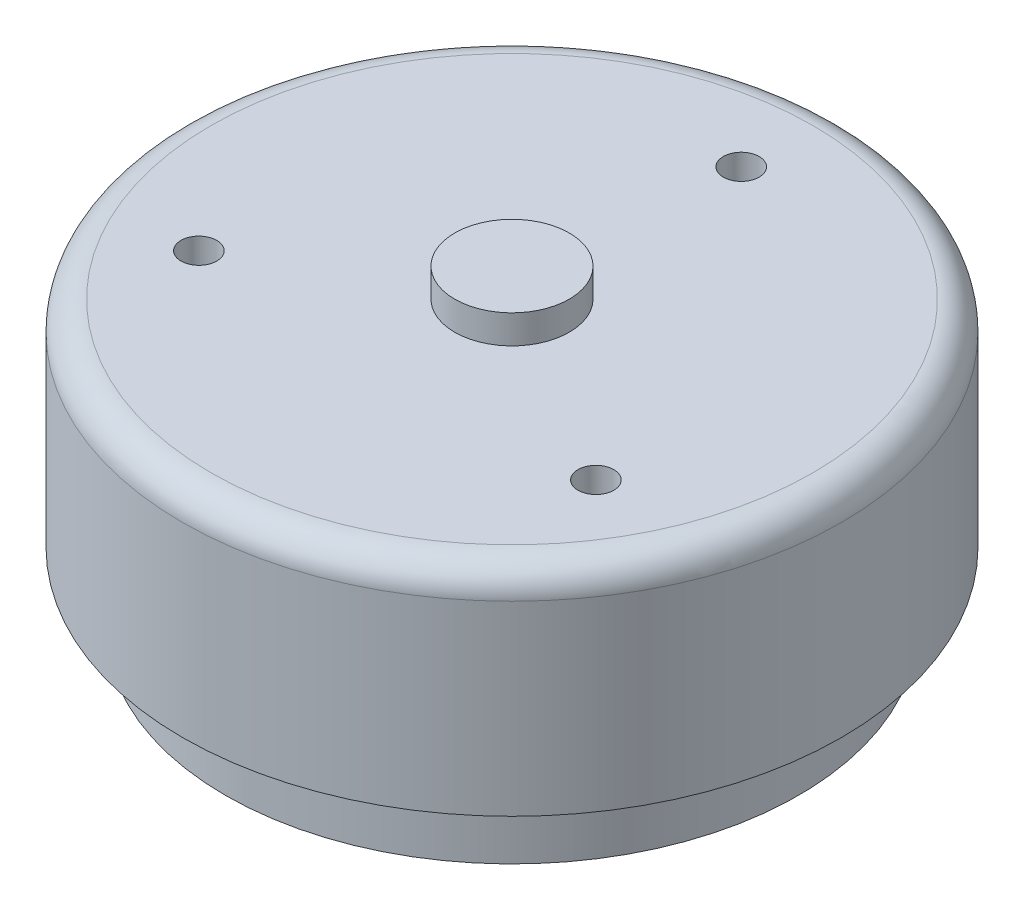
ISO-10303-21;
HEADER;
FILE_DESCRIPTION(('STEP AP214'),'2;1');
FILE_NAME('part.step','',(''),(''),'','','');
FILE_SCHEMA(('AUTOMOTIVE_DESIGN { 1 0 10303 214 1 1 1 1 }'));
ENDSEC;
DATA;
#1=APPLICATION_CONTEXT('core data for automotive mechanical design processes');
#2=APPLICATION_PROTOCOL_DEFINITION('international standard','automotive_design',2000,#1);
#3=PRODUCT_CONTEXT('',#1,'mechanical');
#4=PRODUCT('Part','Part','',(#3));
#5=PRODUCT_RELATED_PRODUCT_CATEGORY('part','',(#4));
#6=PRODUCT_DEFINITION_FORMATION('','',#4);
#7=PRODUCT_DEFINITION_CONTEXT('part definition',#1,'design');
#8=PRODUCT_DEFINITION('design','',#6,#7);
#9=PRODUCT_DEFINITION_SHAPE('','',#8);
#10=(LENGTH_UNIT() NAMED_UNIT(*) SI_UNIT(.MILLI.,.METRE.));
#11=(NAMED_UNIT(*) PLANE_ANGLE_UNIT() SI_UNIT($,.RADIAN.));
#12=(NAMED_UNIT(*) SI_UNIT($,.STERADIAN.) SOLID_ANGLE_UNIT());
#13=UNCERTAINTY_MEASURE_WITH_UNIT(LENGTH_MEASURE(1.E-05),#10,'distance_accuracy_value','');
#14=(GEOMETRIC_REPRESENTATION_CONTEXT(3) GLOBAL_UNCERTAINTY_ASSIGNED_CONTEXT((#13)) GLOBAL_UNIT_ASSIGNED_CONTEXT((#10,
#11,#12)) REPRESENTATION_CONTEXT('',''));
#15=CARTESIAN_POINT('',(0.,0.,0.));
#16=DIRECTION('',(0.,0.,1.));
#17=DIRECTION('',(1.,0.,0.));
#18=AXIS2_PLACEMENT_3D('',#15,#16,#17);
#19=CARTESIAN_POINT('',(-50.,10.,26.5605836335135));
#20=DIRECTION('',(0.,1.,0.));
#21=DIRECTION('',(0.,0.,1.));
#22=AXIS2_PLACEMENT_3D('',#19,#20,#21);
#23=PLANE('',#22);
#24=CARTESIAN_POINT('',(0.,10.,0.));
#25=DIRECTION('',(0.,1.,0.));
#26=DIRECTION('',(0.,0.,1.));
#27=AXIS2_PLACEMENT_3D('',#24,#25,#26);
#28=CIRCLE('',#27,23.);
#29=CARTESIAN_POINT('',(0.,10.,23.));
#30=VERTEX_POINT('',#29);
#31=EDGE_CURVE('E51',#30,#30,#28,.T.);
#32=ORIENTED_EDGE('',*,*,#31,.F.);
#33=EDGE_LOOP('',(#32));
#34=FACE_BOUND('',#33,.T.);
#35=CARTESIAN_POINT('',(0.,10.,0.));
#36=DIRECTION('',(0.,1.,0.));
#37=DIRECTION('',(0.,0.,1.));
#38=AXIS2_PLACEMENT_3D('',#35,#36,#37);
#39=CIRCLE('',#38,20.);
#40=CARTESIAN_POINT('',(0.,10.,20.));
#41=VERTEX_POINT('',#40);
#42=EDGE_CURVE('E10',#41,#41,#39,.F.);
#43=ORIENTED_EDGE('',*,*,#42,.F.);
#44=EDGE_LOOP('',(#43));
#45=FACE_BOUND('',#44,.T.);
#46=ADVANCED_FACE('F32',(#34,#45),#23,.F.);
#47=CARTESIAN_POINT('',(0.,25.,0.));
#48=DIRECTION('',(0.,1.,0.));
#49=DIRECTION('',(0.,0.,1.));
#50=AXIS2_PLACEMENT_3D('',#47,#48,#49);
#51=PLANE('',#50);
#52=CARTESIAN_POINT('',(0.,25.,0.));
#53=DIRECTION('',(0.,1.,0.));
#54=DIRECTION('',(0.,0.,1.));
#55=AXIS2_PLACEMENT_3D('',#52,#53,#54);
#56=CIRCLE('',#55,21.);
#57=CARTESIAN_POINT('',(0.,25.,21.));
#58=VERTEX_POINT('',#57);
#59=EDGE_CURVE('E43',#58,#58,#56,.T.);
#60=ORIENTED_EDGE('',*,*,#59,.T.);
#61=EDGE_LOOP('',(#60));
#62=FACE_BOUND('',#61,.T.);
#63=CARTESIAN_POINT('',(-13.856406460551,25.,8.00000000000007));
#64=DIRECTION('',(0.,1.,0.));
#65=DIRECTION('',(0.,0.,1.));
#66=AXIS2_PLACEMENT_3D('',#63,#64,#65);
#67=CIRCLE('',#66,1.25);
#68=CARTESIAN_POINT('',(-13.856406460551,25.,9.25000000000007));
#69=VERTEX_POINT('',#68);
#70=EDGE_CURVE('E77',#69,#69,#67,.T.);
#71=ORIENTED_EDGE('',*,*,#70,.F.);
#72=EDGE_LOOP('',(#71));
#73=FACE_BOUND('',#72,.T.);
#74=CARTESIAN_POINT('',(0.,25.,-16.));
#75=DIRECTION('',(0.,1.,0.));
#76=DIRECTION('',(0.,0.,1.));
#77=AXIS2_PLACEMENT_3D('',#74,#75,#76);
#78=CIRCLE('',#77,1.25);
#79=CARTESIAN_POINT('',(0.,25.,-14.75));
#80=VERTEX_POINT('',#79);
#81=EDGE_CURVE('E71',#80,#80,#78,.T.);
#82=ORIENTED_EDGE('',*,*,#81,.F.);
#83=EDGE_LOOP('',(#82));
#84=FACE_BOUND('',#83,.T.);
#85=CARTESIAN_POINT('',(13.856406460551,25.,8.00000000000008));
#86=DIRECTION('',(0.,1.,0.));
#87=DIRECTION('',(0.,0.,1.));
#88=AXIS2_PLACEMENT_3D('',#85,#86,#87);
#89=CIRCLE('',#88,1.25);
#90=CARTESIAN_POINT('',(13.856406460551,25.,9.25000000000008));
#91=VERTEX_POINT('',#90);
#92=EDGE_CURVE('E66',#91,#91,#89,.T.);
#93=ORIENTED_EDGE('',*,*,#92,.F.);
#94=EDGE_LOOP('',(#93));
#95=FACE_BOUND('',#94,.T.);
#96=CARTESIAN_POINT('',(0.,25.,0.));
#97=DIRECTION('',(0.,1.,0.));
#98=DIRECTION('',(0.,0.,1.));
#99=AXIS2_PLACEMENT_3D('',#96,#97,#98);
#100=CIRCLE('',#99,4.);
#101=CARTESIAN_POINT('',(0.,25.,4.));
#102=VERTEX_POINT('',#101);
#103=EDGE_CURVE('E53',#102,#102,#100,.T.);
#104=ORIENTED_EDGE('',*,*,#103,.F.);
#105=EDGE_LOOP('',(#104));
#106=FACE_BOUND('',#105,.T.);
#107=ADVANCED_FACE('F86',(#62,#73,#84,#95,#106),#51,.T.);
#108=CARTESIAN_POINT('',(0.,25.,0.));
#109=DIRECTION('',(0.,-1.,0.));
#110=DIRECTION('',(0.,0.,-1.));
#111=AXIS2_PLACEMENT_3D('',#108,#109,#110);
#112=CYLINDRICAL_SURFACE('',#111,23.);
#113=ORIENTED_EDGE('',*,*,#31,.T.);
#114=EDGE_LOOP('',(#113));
#115=FACE_BOUND('',#114,.T.);
#116=CARTESIAN_POINT('',(0.,23.,0.));
#117=DIRECTION('',(0.,1.,0.));
#118=DIRECTION('',(0.,0.,1.));
#119=AXIS2_PLACEMENT_3D('',#116,#117,#118);
#120=CIRCLE('',#119,23.);
#121=CARTESIAN_POINT('',(0.,23.,23.));
#122=VERTEX_POINT('',#121);
#123=EDGE_CURVE('E39',#122,#122,#120,.F.);
#124=ORIENTED_EDGE('',*,*,#123,.T.);
#125=EDGE_LOOP('',(#124));
#126=FACE_BOUND('',#125,.T.);
#127=ADVANCED_FACE('F89',(#115,#126),#112,.T.);
#128=CARTESIAN_POINT('',(-13.856406460551,20.,8.00000000000007));
#129=DIRECTION('',(0.,1.,0.));
#130=DIRECTION('',(0.,0.,1.));
#131=AXIS2_PLACEMENT_3D('',#128,#129,#130);
#132=CYLINDRICAL_SURFACE('',#131,1.25);
#133=CARTESIAN_POINT('',(-13.856406460551,20.,8.00000000000007));
#134=DIRECTION('',(0.,1.,0.));
#135=DIRECTION('',(0.,0.,1.));
#136=AXIS2_PLACEMENT_3D('',#133,#134,#135);
#137=CIRCLE('',#136,1.25);
#138=CARTESIAN_POINT('',(-13.856406460551,20.,9.25000000000007));
#139=VERTEX_POINT('',#138);
#140=EDGE_CURVE('E48',#139,#139,#137,.T.);
#141=ORIENTED_EDGE('',*,*,#140,.F.);
#142=EDGE_LOOP('',(#141));
#143=FACE_BOUND('',#142,.T.);
#144=ORIENTED_EDGE('',*,*,#70,.T.);
#145=EDGE_LOOP('',(#144));
#146=FACE_BOUND('',#145,.T.);
#147=ADVANCED_FACE('F84',(#143,#146),#132,.F.);
#148=CARTESIAN_POINT('',(-13.856406460551,20.,8.00000000000007));
#149=DIRECTION('',(0.,1.,0.));
#150=DIRECTION('',(0.,0.,1.));
#151=AXIS2_PLACEMENT_3D('',#148,#149,#150);
#152=PLANE('',#151);
#153=ORIENTED_EDGE('',*,*,#140,.T.);
#154=EDGE_LOOP('',(#153));
#155=FACE_BOUND('',#154,.T.);
#156=ADVANCED_FACE('F166',(#155),#152,.T.);
#157=CARTESIAN_POINT('',(0.,20.,-16.));
#158=DIRECTION('',(0.,1.,0.));
#159=DIRECTION('',(0.,0.,1.));
#160=AXIS2_PLACEMENT_3D('',#157,#158,#159);
#161=CYLINDRICAL_SURFACE('',#160,1.25);
#162=CARTESIAN_POINT('',(0.,20.,-16.));
#163=DIRECTION('',(0.,1.,0.));
#164=DIRECTION('',(0.,0.,1.));
#165=AXIS2_PLACEMENT_3D('',#162,#163,#164);
#166=CIRCLE('',#165,1.25);
#167=CARTESIAN_POINT('',(0.,20.,-14.75));
#168=VERTEX_POINT('',#167);
#169=EDGE_CURVE('E74',#168,#168,#166,.T.);
#170=ORIENTED_EDGE('',*,*,#169,.F.);
#171=EDGE_LOOP('',(#170));
#172=FACE_BOUND('',#171,.T.);
#173=ORIENTED_EDGE('',*,*,#81,.T.);
#174=EDGE_LOOP('',(#173));
#175=FACE_BOUND('',#174,.T.);
#176=ADVANCED_FACE('F174',(#172,#175),#161,.F.);
#177=CARTESIAN_POINT('',(0.,20.,-16.));
#178=DIRECTION('',(0.,1.,0.));
#179=DIRECTION('',(0.,0.,1.));
#180=AXIS2_PLACEMENT_3D('',#177,#178,#179);
#181=PLANE('',#180);
#182=ORIENTED_EDGE('',*,*,#169,.T.);
#183=EDGE_LOOP('',(#182));
#184=FACE_BOUND('',#183,.T.);
#185=ADVANCED_FACE('F182',(#184),#181,.T.);
#186=CARTESIAN_POINT('',(13.856406460551,20.,8.00000000000008));
#187=DIRECTION('',(0.,1.,0.));
#188=DIRECTION('',(0.,0.,1.));
#189=AXIS2_PLACEMENT_3D('',#186,#187,#188);
#190=CYLINDRICAL_SURFACE('',#189,1.25);
#191=CARTESIAN_POINT('',(13.856406460551,20.,8.00000000000008));
#192=DIRECTION('',(0.,1.,0.));
#193=DIRECTION('',(0.,0.,1.));
#194=AXIS2_PLACEMENT_3D('',#191,#192,#193);
#195=CIRCLE('',#194,1.25);
#196=CARTESIAN_POINT('',(13.856406460551,20.,9.25000000000008));
#197=VERTEX_POINT('',#196);
#198=EDGE_CURVE('E68',#197,#197,#195,.T.);
#199=ORIENTED_EDGE('',*,*,#198,.F.);
#200=EDGE_LOOP('',(#199));
#201=FACE_BOUND('',#200,.T.);
#202=ORIENTED_EDGE('',*,*,#92,.T.);
#203=EDGE_LOOP('',(#202));
#204=FACE_BOUND('',#203,.T.);
#205=ADVANCED_FACE('F110',(#201,#204),#190,.F.);
#206=CARTESIAN_POINT('',(13.856406460551,20.,8.00000000000008));
#207=DIRECTION('',(0.,1.,0.));
#208=DIRECTION('',(0.,0.,1.));
#209=AXIS2_PLACEMENT_3D('',#206,#207,#208);
#210=PLANE('',#209);
#211=ORIENTED_EDGE('',*,*,#198,.T.);
#212=EDGE_LOOP('',(#211));
#213=FACE_BOUND('',#212,.T.);
#214=ADVANCED_FACE('F101',(#213),#210,.T.);
#215=CARTESIAN_POINT('',(0.,27.,0.));
#216=DIRECTION('',(0.,-1.,0.));
#217=DIRECTION('',(0.,0.,-1.));
#218=AXIS2_PLACEMENT_3D('',#215,#216,#217);
#219=CYLINDRICAL_SURFACE('',#218,4.);
#220=CARTESIAN_POINT('',(0.,27.,0.));
#221=DIRECTION('',(0.,1.,0.));
#222=DIRECTION('',(0.,0.,1.));
#223=AXIS2_PLACEMENT_3D('',#220,#221,#222);
#224=CIRCLE('',#223,4.);
#225=CARTESIAN_POINT('',(0.,27.,4.));
#226=VERTEX_POINT('',#225);
#227=EDGE_CURVE('E58',#226,#226,#224,.T.);
#228=ORIENTED_EDGE('',*,*,#227,.F.);
#229=EDGE_LOOP('',(#228));
#230=FACE_BOUND('',#229,.T.);
#231=ORIENTED_EDGE('',*,*,#103,.T.);
#232=EDGE_LOOP('',(#231));
#233=FACE_BOUND('',#232,.T.);
#234=ADVANCED_FACE('F98',(#230,#233),#219,.T.);
#235=CARTESIAN_POINT('',(0.,27.,0.));
#236=DIRECTION('',(0.,1.,0.));
#237=DIRECTION('',(0.,0.,1.));
#238=AXIS2_PLACEMENT_3D('',#235,#236,#237);
#239=PLANE('',#238);
#240=ORIENTED_EDGE('',*,*,#227,.T.);
#241=EDGE_LOOP('',(#240));
#242=FACE_BOUND('',#241,.T.);
#243=ADVANCED_FACE('F100',(#242),#239,.T.);
#244=CARTESIAN_POINT('',(0.,23.,0.));
#245=DIRECTION('',(0.,1.,0.));
#246=DIRECTION('',(0.,0.,1.));
#247=AXIS2_PLACEMENT_3D('',#244,#245,#246);
#248=TOROIDAL_SURFACE('',#247,21.,2.);
#249=ORIENTED_EDGE('',*,*,#123,.F.);
#250=EDGE_LOOP('',(#249));
#251=FACE_BOUND('',#250,.T.);
#252=ORIENTED_EDGE('',*,*,#59,.F.);
#253=EDGE_LOOP('',(#252));
#254=FACE_BOUND('',#253,.T.);
#255=ADVANCED_FACE('F34',(#251,#254),#248,.T.);
#256=CARTESIAN_POINT('',(0.,5.,0.));
#257=DIRECTION('',(0.,1.,0.));
#258=DIRECTION('',(0.,0.,1.));
#259=AXIS2_PLACEMENT_3D('',#256,#257,#258);
#260=CYLINDRICAL_SURFACE('',#259,20.);
#261=CARTESIAN_POINT('',(0.,5.,0.));
#262=DIRECTION('',(0.,-1.,0.));
#263=DIRECTION('',(0.,0.,-1.));
#264=AXIS2_PLACEMENT_3D('',#261,#262,#263);
#265=CIRCLE('',#264,20.);
#266=CARTESIAN_POINT('',(0.,5.,-20.));
#267=VERTEX_POINT('',#266);
#268=EDGE_CURVE('E54',#267,#267,#265,.T.);
#269=ORIENTED_EDGE('',*,*,#268,.F.);
#270=EDGE_LOOP('',(#269));
#271=FACE_BOUND('',#270,.T.);
#272=ORIENTED_EDGE('',*,*,#42,.T.);
#273=EDGE_LOOP('',(#272));
#274=FACE_BOUND('',#273,.T.);
#275=ADVANCED_FACE('F121',(#271,#274),#260,.T.);
#276=CARTESIAN_POINT('',(0.,5.,0.));
#277=DIRECTION('',(0.,-1.,0.));
#278=DIRECTION('',(0.,0.,-1.));
#279=AXIS2_PLACEMENT_3D('',#276,#277,#278);
#280=PLANE('',#279);
#281=ORIENTED_EDGE('',*,*,#268,.T.);
#282=EDGE_LOOP('',(#281));
#283=FACE_BOUND('',#282,.T.);
#284=ADVANCED_FACE('F124',(#283),#280,.T.);
#285=CLOSED_SHELL('',(#46,#107,#127,#147,#156,#176,#185,#205,#214,#234,#243,#255,#275,#284));
#286=MANIFOLD_SOLID_BREP('B2',#285);
#287=ADVANCED_BREP_SHAPE_REPRESENTATION('',(#18,#286),#14);
#288=SHAPE_DEFINITION_REPRESENTATION(#9,#287);
ENDSEC;
END-ISO-10303-21;
